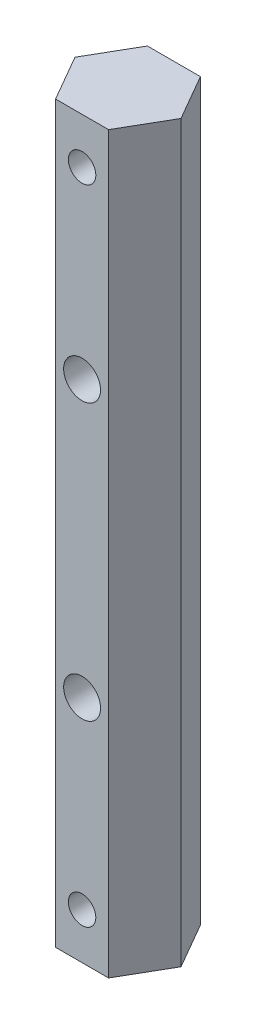
ISO-10303-21;
HEADER;
FILE_DESCRIPTION(('STEP AP214'),'2;1');
FILE_NAME('part.step','',(''),(''),'','','');
FILE_SCHEMA(('AUTOMOTIVE_DESIGN { 1 0 10303 214 1 1 1 1 }'));
ENDSEC;
DATA;
#1=APPLICATION_CONTEXT('core data for automotive mechanical design processes');
#2=APPLICATION_PROTOCOL_DEFINITION('international standard','automotive_design',2000,#1);
#3=PRODUCT_CONTEXT('',#1,'mechanical');
#4=PRODUCT('Part','Part','',(#3));
#5=PRODUCT_RELATED_PRODUCT_CATEGORY('part','',(#4));
#6=PRODUCT_DEFINITION_FORMATION('','',#4);
#7=PRODUCT_DEFINITION_CONTEXT('part definition',#1,'design');
#8=PRODUCT_DEFINITION('design','',#6,#7);
#9=PRODUCT_DEFINITION_SHAPE('','',#8);
#10=(LENGTH_UNIT() NAMED_UNIT(*) SI_UNIT(.MILLI.,.METRE.));
#11=(NAMED_UNIT(*) PLANE_ANGLE_UNIT() SI_UNIT($,.RADIAN.));
#12=(NAMED_UNIT(*) SI_UNIT($,.STERADIAN.) SOLID_ANGLE_UNIT());
#13=UNCERTAINTY_MEASURE_WITH_UNIT(LENGTH_MEASURE(1.E-05),#10,'distance_accuracy_value','');
#14=(GEOMETRIC_REPRESENTATION_CONTEXT(3) GLOBAL_UNCERTAINTY_ASSIGNED_CONTEXT((#13)) GLOBAL_UNIT_ASSIGNED_CONTEXT((#10,
#11,#12)) REPRESENTATION_CONTEXT('',''));
#15=CARTESIAN_POINT('',(0.,0.,0.));
#16=DIRECTION('',(0.,0.,1.));
#17=DIRECTION('',(1.,0.,0.));
#18=AXIS2_PLACEMENT_3D('',#15,#16,#17);
#19=CARTESIAN_POINT('',(3.66617420935418,101.6,6.34999999999993));
#20=DIRECTION('',(-0.866025403784442,0.,-0.499999999999995));
#21=DIRECTION('',(-0.499999999999995,0.,0.866025403784442));
#22=AXIS2_PLACEMENT_3D('',#19,#20,#21);
#23=PLANE('',#22);
#24=DIRECTION('',(0.499999999999995,0.,-0.866025403784442));
#25=VECTOR('',#24,1.);
#26=CARTESIAN_POINT('',(3.66617420935418,0.,6.34999999999993));
#27=LINE('',#26,#25);
#28=CARTESIAN_POINT('',(3.66617420935418,0.,6.34999999999993));
#29=VERTEX_POINT('',#28);
#30=CARTESIAN_POINT('',(7.33234841870822,0.,0.));
#31=VERTEX_POINT('',#30);
#32=EDGE_CURVE('E119',#29,#31,#27,.T.);
#33=ORIENTED_EDGE('',*,*,#32,.T.);
#34=DIRECTION('',(0.,-1.,0.));
#35=VECTOR('',#34,1.);
#36=CARTESIAN_POINT('',(7.33234841870822,101.6,0.));
#37=LINE('',#36,#35);
#38=CARTESIAN_POINT('',(7.33234841870822,101.6,0.));
#39=VERTEX_POINT('',#38);
#40=EDGE_CURVE('E11',#39,#31,#37,.T.);
#41=ORIENTED_EDGE('',*,*,#40,.F.);
#42=DIRECTION('',(0.499999999999995,0.,-0.866025403784442));
#43=VECTOR('',#42,1.);
#44=CARTESIAN_POINT('',(3.66617420935418,101.6,6.34999999999993));
#45=LINE('',#44,#43);
#46=CARTESIAN_POINT('',(3.66617420935418,101.6,6.34999999999993));
#47=VERTEX_POINT('',#46);
#48=EDGE_CURVE('E130',#47,#39,#45,.T.);
#49=ORIENTED_EDGE('',*,*,#48,.F.);
#50=DIRECTION('',(0.,-1.,0.));
#51=VECTOR('',#50,1.);
#52=CARTESIAN_POINT('',(3.66617420935418,101.6,6.34999999999993));
#53=LINE('',#52,#51);
#54=EDGE_CURVE('E115',#47,#29,#53,.T.);
#55=ORIENTED_EDGE('',*,*,#54,.T.);
#56=EDGE_LOOP('',(#33,#41,#49,#55));
#57=FACE_BOUND('',#56,.T.);
#58=ADVANCED_FACE('F35',(#57),#23,.F.);
#59=CARTESIAN_POINT('',(7.33234841870822,101.6,0.));
#60=DIRECTION('',(-0.866025403784438,0.,0.500000000000001));
#61=DIRECTION('',(0.500000000000001,0.,0.866025403784438));
#62=AXIS2_PLACEMENT_3D('',#59,#60,#61);
#63=PLANE('',#62);
#64=DIRECTION('',(-0.500000000000001,0.,-0.866025403784438));
#65=VECTOR('',#64,1.);
#66=CARTESIAN_POINT('',(7.33234841870822,0.,0.));
#67=LINE('',#66,#65);
#68=CARTESIAN_POINT('',(3.6661742093541,0.,-6.34999999999999));
#69=VERTEX_POINT('',#68);
#70=EDGE_CURVE('E122',#31,#69,#67,.T.);
#71=ORIENTED_EDGE('',*,*,#70,.T.);
#72=DIRECTION('',(0.,-1.,0.));
#73=VECTOR('',#72,1.);
#74=CARTESIAN_POINT('',(3.6661742093541,101.6,-6.34999999999999));
#75=LINE('',#74,#73);
#76=CARTESIAN_POINT('',(3.6661742093541,101.6,-6.34999999999999));
#77=VERTEX_POINT('',#76);
#78=EDGE_CURVE('E43',#77,#69,#75,.T.);
#79=ORIENTED_EDGE('',*,*,#78,.F.);
#80=DIRECTION('',(-0.500000000000001,0.,-0.866025403784438));
#81=VECTOR('',#80,1.);
#82=CARTESIAN_POINT('',(7.33234841870822,101.6,0.));
#83=LINE('',#82,#81);
#84=EDGE_CURVE('E88',#39,#77,#83,.T.);
#85=ORIENTED_EDGE('',*,*,#84,.F.);
#86=ORIENTED_EDGE('',*,*,#40,.T.);
#87=EDGE_LOOP('',(#71,#79,#85,#86));
#88=FACE_BOUND('',#87,.T.);
#89=ADVANCED_FACE('F157',(#88),#63,.F.);
#90=CARTESIAN_POINT('',(3.6661742093541,101.6,-6.34999999999999));
#91=DIRECTION('',(0.,0.,1.));
#92=DIRECTION('',(1.,0.,0.));
#93=AXIS2_PLACEMENT_3D('',#90,#91,#92);
#94=PLANE('',#93);
#95=CARTESIAN_POINT('',(0.,31.75,-6.34999999999999));
#96=DIRECTION('',(0.,0.,1.));
#97=DIRECTION('',(1.,0.,0.));
#98=AXIS2_PLACEMENT_3D('',#95,#96,#97);
#99=CIRCLE('',#98,2.5527);
#100=CARTESIAN_POINT('',(2.55270000000007,31.75,-6.34999999999999));
#101=VERTEX_POINT('',#100);
#102=EDGE_CURVE('E245',#101,#101,#99,.T.);
#103=ORIENTED_EDGE('',*,*,#102,.T.);
#104=EDGE_LOOP('',(#103));
#105=FACE_BOUND('',#104,.T.);
#106=CARTESIAN_POINT('',(0.,69.85,-6.34999999999999));
#107=DIRECTION('',(0.,0.,1.));
#108=DIRECTION('',(1.,0.,0.));
#109=AXIS2_PLACEMENT_3D('',#106,#107,#108);
#110=CIRCLE('',#109,2.5527);
#111=CARTESIAN_POINT('',(2.55270000000006,69.85,-6.34999999999999));
#112=VERTEX_POINT('',#111);
#113=EDGE_CURVE('E248',#112,#112,#110,.T.);
#114=ORIENTED_EDGE('',*,*,#113,.T.);
#115=EDGE_LOOP('',(#114));
#116=FACE_BOUND('',#115,.T.);
#117=CARTESIAN_POINT('',(0.,95.25,-6.34999999999999));
#118=DIRECTION('',(0.,0.,1.));
#119=DIRECTION('',(1.,0.,0.));
#120=AXIS2_PLACEMENT_3D('',#117,#118,#119);
#121=CIRCLE('',#120,1.89865);
#122=CARTESIAN_POINT('',(1.89865,95.25,-6.34999999999999));
#123=VERTEX_POINT('',#122);
#124=EDGE_CURVE('E260',#123,#123,#121,.T.);
#125=ORIENTED_EDGE('',*,*,#124,.T.);
#126=EDGE_LOOP('',(#125));
#127=FACE_BOUND('',#126,.T.);
#128=CARTESIAN_POINT('',(0.,6.34999999999999,-6.34999999999999));
#129=DIRECTION('',(0.,0.,1.));
#130=DIRECTION('',(1.,0.,0.));
#131=AXIS2_PLACEMENT_3D('',#128,#129,#130);
#132=CIRCLE('',#131,1.89865);
#133=CARTESIAN_POINT('',(1.89865,6.34999999999999,-6.34999999999999));
#134=VERTEX_POINT('',#133);
#135=EDGE_CURVE('E123',#134,#134,#132,.T.);
#136=ORIENTED_EDGE('',*,*,#135,.T.);
#137=EDGE_LOOP('',(#136));
#138=FACE_BOUND('',#137,.T.);
#139=DIRECTION('',(-1.,0.,0.));
#140=VECTOR('',#139,1.);
#141=CARTESIAN_POINT('',(3.6661742093541,0.,-6.34999999999999));
#142=LINE('',#141,#140);
#143=CARTESIAN_POINT('',(-3.66617420935414,0.,-6.34999999999996));
#144=VERTEX_POINT('',#143);
#145=EDGE_CURVE('E125',#69,#144,#142,.T.);
#146=ORIENTED_EDGE('',*,*,#145,.T.);
#147=DIRECTION('',(0.,-1.,0.));
#148=VECTOR('',#147,1.);
#149=CARTESIAN_POINT('',(-3.66617420935414,101.6,-6.34999999999996));
#150=LINE('',#149,#148);
#151=CARTESIAN_POINT('',(-3.66617420935414,101.6,-6.34999999999996));
#152=VERTEX_POINT('',#151);
#153=EDGE_CURVE('E110',#152,#144,#150,.T.);
#154=ORIENTED_EDGE('',*,*,#153,.F.);
#155=DIRECTION('',(-1.,0.,0.));
#156=VECTOR('',#155,1.);
#157=CARTESIAN_POINT('',(3.6661742093541,101.6,-6.34999999999999));
#158=LINE('',#157,#156);
#159=EDGE_CURVE('E101',#77,#152,#158,.T.);
#160=ORIENTED_EDGE('',*,*,#159,.F.);
#161=ORIENTED_EDGE('',*,*,#78,.T.);
#162=EDGE_LOOP('',(#146,#154,#160,#161));
#163=FACE_BOUND('',#162,.T.);
#164=ADVANCED_FACE('F136',(#105,#116,#127,#138,#163),#94,.F.);
#165=CARTESIAN_POINT('',(-3.66617420935414,101.6,-6.34999999999996));
#166=DIRECTION('',(0.866025403784442,0.,0.499999999999995));
#167=DIRECTION('',(0.499999999999995,0.,-0.866025403784442));
#168=AXIS2_PLACEMENT_3D('',#165,#166,#167);
#169=PLANE('',#168);
#170=DIRECTION('',(-0.499999999999995,0.,0.866025403784442));
#171=VECTOR('',#170,1.);
#172=CARTESIAN_POINT('',(-3.66617420935414,0.,-6.34999999999996));
#173=LINE('',#172,#171);
#174=CARTESIAN_POINT('',(-7.33234841870822,0.,0.));
#175=VERTEX_POINT('',#174);
#176=EDGE_CURVE('E109',#144,#175,#173,.T.);
#177=ORIENTED_EDGE('',*,*,#176,.T.);
#178=DIRECTION('',(0.,-1.,0.));
#179=VECTOR('',#178,1.);
#180=CARTESIAN_POINT('',(-7.33234841870822,101.6,0.));
#181=LINE('',#180,#179);
#182=CARTESIAN_POINT('',(-7.33234841870822,101.6,0.));
#183=VERTEX_POINT('',#182);
#184=EDGE_CURVE('E106',#183,#175,#181,.T.);
#185=ORIENTED_EDGE('',*,*,#184,.F.);
#186=DIRECTION('',(-0.499999999999995,0.,0.866025403784442));
#187=VECTOR('',#186,1.);
#188=CARTESIAN_POINT('',(-3.66617420935414,101.6,-6.34999999999996));
#189=LINE('',#188,#187);
#190=EDGE_CURVE('E95',#152,#183,#189,.T.);
#191=ORIENTED_EDGE('',*,*,#190,.F.);
#192=ORIENTED_EDGE('',*,*,#153,.T.);
#193=EDGE_LOOP('',(#177,#185,#191,#192));
#194=FACE_BOUND('',#193,.T.);
#195=ADVANCED_FACE('F107',(#194),#169,.F.);
#196=CARTESIAN_POINT('',(-7.33234841870822,101.6,0.));
#197=DIRECTION('',(0.866025403784435,0.,-0.500000000000007));
#198=DIRECTION('',(-0.500000000000007,0.,-0.866025403784435));
#199=AXIS2_PLACEMENT_3D('',#196,#197,#198);
#200=PLANE('',#199);
#201=DIRECTION('',(0.500000000000007,0.,0.866025403784435));
#202=VECTOR('',#201,1.);
#203=CARTESIAN_POINT('',(-7.33234841870822,0.,0.));
#204=LINE('',#203,#202);
#205=CARTESIAN_POINT('',(-3.66617420935405,0.,6.35000000000001));
#206=VERTEX_POINT('',#205);
#207=EDGE_CURVE('E74',#175,#206,#204,.T.);
#208=ORIENTED_EDGE('',*,*,#207,.T.);
#209=DIRECTION('',(0.,-1.,0.));
#210=VECTOR('',#209,1.);
#211=CARTESIAN_POINT('',(-3.66617420935405,101.6,6.35000000000001));
#212=LINE('',#211,#210);
#213=CARTESIAN_POINT('',(-3.66617420935405,101.6,6.35000000000001));
#214=VERTEX_POINT('',#213);
#215=EDGE_CURVE('E111',#214,#206,#212,.T.);
#216=ORIENTED_EDGE('',*,*,#215,.F.);
#217=DIRECTION('',(0.500000000000007,0.,0.866025403784435));
#218=VECTOR('',#217,1.);
#219=CARTESIAN_POINT('',(-7.33234841870822,101.6,0.));
#220=LINE('',#219,#218);
#221=EDGE_CURVE('E99',#183,#214,#220,.T.);
#222=ORIENTED_EDGE('',*,*,#221,.F.);
#223=ORIENTED_EDGE('',*,*,#184,.T.);
#224=EDGE_LOOP('',(#208,#216,#222,#223));
#225=FACE_BOUND('',#224,.T.);
#226=ADVANCED_FACE('F113',(#225),#200,.F.);
#227=CARTESIAN_POINT('',(-3.66617420935405,101.6,6.35000000000001));
#228=DIRECTION('',(0.,0.,-1.));
#229=DIRECTION('',(-1.,0.,0.));
#230=AXIS2_PLACEMENT_3D('',#227,#228,#229);
#231=PLANE('',#230);
#232=CARTESIAN_POINT('',(0.,31.75,6.34999999999997));
#233=DIRECTION('',(0.,0.,1.));
#234=DIRECTION('',(1.,0.,0.));
#235=AXIS2_PLACEMENT_3D('',#232,#233,#234);
#236=CIRCLE('',#235,2.5527);
#237=CARTESIAN_POINT('',(2.55270000000007,31.75,6.34999999999997));
#238=VERTEX_POINT('',#237);
#239=EDGE_CURVE('E247',#238,#238,#236,.T.);
#240=ORIENTED_EDGE('',*,*,#239,.F.);
#241=EDGE_LOOP('',(#240));
#242=FACE_BOUND('',#241,.T.);
#243=CARTESIAN_POINT('',(0.,69.85,6.34999999999997));
#244=DIRECTION('',(0.,0.,1.));
#245=DIRECTION('',(1.,0.,0.));
#246=AXIS2_PLACEMENT_3D('',#243,#244,#245);
#247=CIRCLE('',#246,2.5527);
#248=CARTESIAN_POINT('',(2.55270000000006,69.85,6.34999999999997));
#249=VERTEX_POINT('',#248);
#250=EDGE_CURVE('E253',#249,#249,#247,.T.);
#251=ORIENTED_EDGE('',*,*,#250,.F.);
#252=EDGE_LOOP('',(#251));
#253=FACE_BOUND('',#252,.T.);
#254=CARTESIAN_POINT('',(0.,95.25,6.34999999999997));
#255=DIRECTION('',(0.,0.,1.));
#256=DIRECTION('',(1.,0.,0.));
#257=AXIS2_PLACEMENT_3D('',#254,#255,#256);
#258=CIRCLE('',#257,1.89865);
#259=CARTESIAN_POINT('',(1.89865,95.25,6.34999999999997));
#260=VERTEX_POINT('',#259);
#261=EDGE_CURVE('E250',#260,#260,#258,.T.);
#262=ORIENTED_EDGE('',*,*,#261,.F.);
#263=EDGE_LOOP('',(#262));
#264=FACE_BOUND('',#263,.T.);
#265=CARTESIAN_POINT('',(0.,6.34999999999999,6.34999999999997));
#266=DIRECTION('',(0.,0.,1.));
#267=DIRECTION('',(1.,0.,0.));
#268=AXIS2_PLACEMENT_3D('',#265,#266,#267);
#269=CIRCLE('',#268,1.89865);
#270=CARTESIAN_POINT('',(1.89865,6.34999999999999,6.34999999999997));
#271=VERTEX_POINT('',#270);
#272=EDGE_CURVE('E263',#271,#271,#269,.T.);
#273=ORIENTED_EDGE('',*,*,#272,.F.);
#274=EDGE_LOOP('',(#273));
#275=FACE_BOUND('',#274,.T.);
#276=DIRECTION('',(1.,0.,0.));
#277=VECTOR('',#276,1.);
#278=CARTESIAN_POINT('',(-3.66617420935405,0.,6.35000000000001));
#279=LINE('',#278,#277);
#280=EDGE_CURVE('E80',#206,#29,#279,.T.);
#281=ORIENTED_EDGE('',*,*,#280,.T.);
#282=ORIENTED_EDGE('',*,*,#54,.F.);
#283=DIRECTION('',(1.,0.,0.));
#284=VECTOR('',#283,1.);
#285=CARTESIAN_POINT('',(-3.66617420935405,101.6,6.35000000000001));
#286=LINE('',#285,#284);
#287=EDGE_CURVE('E51',#214,#47,#286,.T.);
#288=ORIENTED_EDGE('',*,*,#287,.F.);
#289=ORIENTED_EDGE('',*,*,#215,.T.);
#290=EDGE_LOOP('',(#281,#282,#288,#289));
#291=FACE_BOUND('',#290,.T.);
#292=ADVANCED_FACE('F143',(#242,#253,#264,#275,#291),#231,.F.);
#293=CARTESIAN_POINT('',(0.,101.6,0.));
#294=DIRECTION('',(0.,1.,0.));
#295=DIRECTION('',(0.,0.,1.));
#296=AXIS2_PLACEMENT_3D('',#293,#294,#295);
#297=PLANE('',#296);
#298=ORIENTED_EDGE('',*,*,#48,.T.);
#299=ORIENTED_EDGE('',*,*,#84,.T.);
#300=ORIENTED_EDGE('',*,*,#159,.T.);
#301=ORIENTED_EDGE('',*,*,#190,.T.);
#302=ORIENTED_EDGE('',*,*,#221,.T.);
#303=ORIENTED_EDGE('',*,*,#287,.T.);
#304=EDGE_LOOP('',(#298,#299,#300,#301,#302,#303));
#305=FACE_BOUND('',#304,.T.);
#306=ADVANCED_FACE('F97',(#305),#297,.T.);
#307=CARTESIAN_POINT('',(0.,0.,0.));
#308=DIRECTION('',(0.,1.,0.));
#309=DIRECTION('',(0.,0.,1.));
#310=AXIS2_PLACEMENT_3D('',#307,#308,#309);
#311=PLANE('',#310);
#312=ORIENTED_EDGE('',*,*,#32,.F.);
#313=ORIENTED_EDGE('',*,*,#280,.F.);
#314=ORIENTED_EDGE('',*,*,#207,.F.);
#315=ORIENTED_EDGE('',*,*,#176,.F.);
#316=ORIENTED_EDGE('',*,*,#145,.F.);
#317=ORIENTED_EDGE('',*,*,#70,.F.);
#318=EDGE_LOOP('',(#312,#313,#314,#315,#316,#317));
#319=FACE_BOUND('',#318,.T.);
#320=ADVANCED_FACE('F139',(#319),#311,.F.);
#321=CARTESIAN_POINT('',(0.,6.34999999999999,6.34999999999997));
#322=DIRECTION('',(0.,0.,1.));
#323=DIRECTION('',(1.,0.,0.));
#324=AXIS2_PLACEMENT_3D('',#321,#322,#323);
#325=CYLINDRICAL_SURFACE('',#324,1.89865);
#326=ORIENTED_EDGE('',*,*,#135,.F.);
#327=EDGE_LOOP('',(#326));
#328=FACE_BOUND('',#327,.T.);
#329=ORIENTED_EDGE('',*,*,#272,.T.);
#330=EDGE_LOOP('',(#329));
#331=FACE_BOUND('',#330,.T.);
#332=ADVANCED_FACE('F192',(#328,#331),#325,.F.);
#333=CARTESIAN_POINT('',(0.,95.25,6.34999999999997));
#334=DIRECTION('',(0.,0.,1.));
#335=DIRECTION('',(1.,0.,0.));
#336=AXIS2_PLACEMENT_3D('',#333,#334,#335);
#337=CYLINDRICAL_SURFACE('',#336,1.89865);
#338=ORIENTED_EDGE('',*,*,#124,.F.);
#339=EDGE_LOOP('',(#338));
#340=FACE_BOUND('',#339,.T.);
#341=ORIENTED_EDGE('',*,*,#261,.T.);
#342=EDGE_LOOP('',(#341));
#343=FACE_BOUND('',#342,.T.);
#344=ADVANCED_FACE('F200',(#340,#343),#337,.F.);
#345=CARTESIAN_POINT('',(0.,69.85,-6.34999999999999));
#346=DIRECTION('',(0.,0.,1.));
#347=DIRECTION('',(1.,0.,0.));
#348=AXIS2_PLACEMENT_3D('',#345,#346,#347);
#349=CYLINDRICAL_SURFACE('',#348,2.5527);
#350=ORIENTED_EDGE('',*,*,#113,.F.);
#351=EDGE_LOOP('',(#350));
#352=FACE_BOUND('',#351,.T.);
#353=ORIENTED_EDGE('',*,*,#250,.T.);
#354=EDGE_LOOP('',(#353));
#355=FACE_BOUND('',#354,.T.);
#356=ADVANCED_FACE('F209',(#352,#355),#349,.F.);
#357=CARTESIAN_POINT('',(0.,31.75,-6.34999999999999));
#358=DIRECTION('',(0.,0.,1.));
#359=DIRECTION('',(1.,0.,0.));
#360=AXIS2_PLACEMENT_3D('',#357,#358,#359);
#361=CYLINDRICAL_SURFACE('',#360,2.5527);
#362=ORIENTED_EDGE('',*,*,#102,.F.);
#363=EDGE_LOOP('',(#362));
#364=FACE_BOUND('',#363,.T.);
#365=ORIENTED_EDGE('',*,*,#239,.T.);
#366=EDGE_LOOP('',(#365));
#367=FACE_BOUND('',#366,.T.);
#368=ADVANCED_FACE('F228',(#364,#367),#361,.F.);
#369=CLOSED_SHELL('',(#58,#89,#164,#195,#226,#292,#306,#320,#332,#344,#356,#368));
#370=MANIFOLD_SOLID_BREP('B2',#369);
#371=ADVANCED_BREP_SHAPE_REPRESENTATION('',(#18,#370),#14);
#372=SHAPE_DEFINITION_REPRESENTATION(#9,#371);
ENDSEC;
END-ISO-10303-21;
